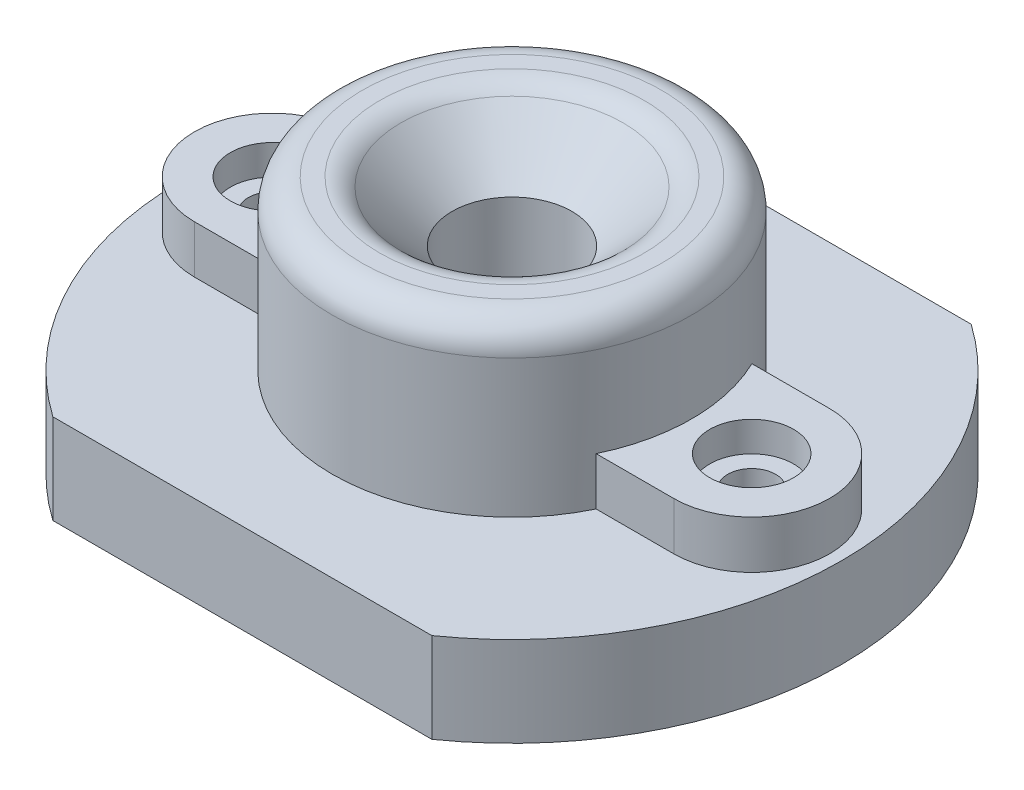
ISO-10303-21;
HEADER;
FILE_DESCRIPTION(('STEP AP214'),'2;1');
FILE_NAME('part.step','',(''),(''),'','','');
FILE_SCHEMA(('AUTOMOTIVE_DESIGN { 1 0 10303 214 1 1 1 1 }'));
ENDSEC;
DATA;
#1=APPLICATION_CONTEXT('core data for automotive mechanical design processes');
#2=APPLICATION_PROTOCOL_DEFINITION('international standard','automotive_design',2000,#1);
#3=PRODUCT_CONTEXT('',#1,'mechanical');
#4=PRODUCT('Part','Part','',(#3));
#5=PRODUCT_RELATED_PRODUCT_CATEGORY('part','',(#4));
#6=PRODUCT_DEFINITION_FORMATION('','',#4);
#7=PRODUCT_DEFINITION_CONTEXT('part definition',#1,'design');
#8=PRODUCT_DEFINITION('design','',#6,#7);
#9=PRODUCT_DEFINITION_SHAPE('','',#8);
#10=(LENGTH_UNIT() NAMED_UNIT(*) SI_UNIT(.MILLI.,.METRE.));
#11=(NAMED_UNIT(*) PLANE_ANGLE_UNIT() SI_UNIT($,.RADIAN.));
#12=(NAMED_UNIT(*) SI_UNIT($,.STERADIAN.) SOLID_ANGLE_UNIT());
#13=UNCERTAINTY_MEASURE_WITH_UNIT(LENGTH_MEASURE(1.E-05),#10,'distance_accuracy_value','');
#14=(GEOMETRIC_REPRESENTATION_CONTEXT(3) GLOBAL_UNCERTAINTY_ASSIGNED_CONTEXT((#13)) GLOBAL_UNIT_ASSIGNED_CONTEXT((#10,
#11,#12)) REPRESENTATION_CONTEXT('',''));
#15=CARTESIAN_POINT('',(0.,0.,0.));
#16=DIRECTION('',(0.,0.,1.));
#17=DIRECTION('',(1.,0.,0.));
#18=AXIS2_PLACEMENT_3D('',#15,#16,#17);
#19=CARTESIAN_POINT('',(0.,15.,0.));
#20=DIRECTION('',(0.,1.,0.));
#21=DIRECTION('',(0.,0.,1.));
#22=AXIS2_PLACEMENT_3D('',#19,#20,#21);
#23=PLANE('',#22);
#24=DIRECTION('',(1.,0.,0.));
#25=VECTOR('',#24,1.);
#26=CARTESIAN_POINT('',(0.,15.,-13.));
#27=LINE('',#26,#25);
#28=CARTESIAN_POINT('',(-40.,15.,-13.));
#29=VERTEX_POINT('',#28);
#30=CARTESIAN_POINT('',(-27.0370116691915,15.,-13.));
#31=VERTEX_POINT('',#30);
#32=EDGE_CURVE('E139',#29,#31,#27,.T.);
#33=ORIENTED_EDGE('',*,*,#32,.T.);
#34=CARTESIAN_POINT('',(0.,15.,0.));
#35=DIRECTION('',(0.,1.,0.));
#36=DIRECTION('',(0.,0.,1.));
#37=AXIS2_PLACEMENT_3D('',#34,#35,#36);
#38=CIRCLE('',#37,30.);
#39=CARTESIAN_POINT('',(27.0370116691915,15.,-13.));
#40=VERTEX_POINT('',#39);
#41=EDGE_CURVE('E240',#40,#31,#38,.T.);
#42=ORIENTED_EDGE('',*,*,#41,.F.);
#43=DIRECTION('',(-1.,0.,0.));
#44=VECTOR('',#43,1.);
#45=CARTESIAN_POINT('',(0.,15.,-13.));
#46=LINE('',#45,#44);
#47=CARTESIAN_POINT('',(40.,15.,-13.));
#48=VERTEX_POINT('',#47);
#49=EDGE_CURVE('E188',#48,#40,#46,.T.);
#50=ORIENTED_EDGE('',*,*,#49,.F.);
#51=CARTESIAN_POINT('',(40.,15.,0.));
#52=DIRECTION('',(0.,1.,0.));
#53=DIRECTION('',(0.,0.,1.));
#54=AXIS2_PLACEMENT_3D('',#51,#52,#53);
#55=CIRCLE('',#54,13.);
#56=CARTESIAN_POINT('',(40.,15.,13.));
#57=VERTEX_POINT('',#56);
#58=EDGE_CURVE('E186',#48,#57,#55,.F.);
#59=ORIENTED_EDGE('',*,*,#58,.T.);
#60=DIRECTION('',(-1.,0.,0.));
#61=VECTOR('',#60,1.);
#62=CARTESIAN_POINT('',(0.,15.,13.));
#63=LINE('',#62,#61);
#64=CARTESIAN_POINT('',(27.0370116691915,15.,13.));
#65=VERTEX_POINT('',#64);
#66=EDGE_CURVE('E176',#57,#65,#63,.T.);
#67=ORIENTED_EDGE('',*,*,#66,.T.);
#68=CARTESIAN_POINT('',(-27.0370116691915,15.,13.));
#69=VERTEX_POINT('',#68);
#70=EDGE_CURVE('E237',#69,#65,#38,.T.);
#71=ORIENTED_EDGE('',*,*,#70,.F.);
#72=DIRECTION('',(1.,0.,0.));
#73=VECTOR('',#72,1.);
#74=CARTESIAN_POINT('',(0.,15.,13.));
#75=LINE('',#74,#73);
#76=CARTESIAN_POINT('',(-40.,15.,13.));
#77=VERTEX_POINT('',#76);
#78=EDGE_CURVE('E65',#77,#69,#75,.T.);
#79=ORIENTED_EDGE('',*,*,#78,.F.);
#80=CARTESIAN_POINT('',(-40.,15.,0.));
#81=DIRECTION('',(0.,1.,0.));
#82=DIRECTION('',(0.,0.,1.));
#83=AXIS2_PLACEMENT_3D('',#80,#81,#82);
#84=CIRCLE('',#83,13.);
#85=EDGE_CURVE('E60',#29,#77,#84,.T.);
#86=ORIENTED_EDGE('',*,*,#85,.F.);
#87=EDGE_LOOP('',(#33,#42,#50,#59,#67,#71,#79,#86));
#88=FACE_BOUND('',#87,.T.);
#89=CARTESIAN_POINT('',(0.,15.,0.));
#90=DIRECTION('',(0.,1.,0.));
#91=DIRECTION('',(0.,0.,1.));
#92=AXIS2_PLACEMENT_3D('',#89,#90,#91);
#93=CIRCLE('',#92,55.);
#94=CARTESIAN_POINT('',(31.6227766016838,15.,45.));
#95=VERTEX_POINT('',#94);
#96=CARTESIAN_POINT('',(31.6227766016838,15.,-45.));
#97=VERTEX_POINT('',#96);
#98=EDGE_CURVE('E208',#95,#97,#93,.T.);
#99=ORIENTED_EDGE('',*,*,#98,.T.);
#100=DIRECTION('',(-1.,0.,0.));
#101=VECTOR('',#100,1.);
#102=CARTESIAN_POINT('',(-31.6227766016838,15.,-45.));
#103=LINE('',#102,#101);
#104=CARTESIAN_POINT('',(-31.6227766016838,15.,-45.));
#105=VERTEX_POINT('',#104);
#106=EDGE_CURVE('E211',#97,#105,#103,.T.);
#107=ORIENTED_EDGE('',*,*,#106,.T.);
#108=CARTESIAN_POINT('',(0.,15.,0.));
#109=DIRECTION('',(0.,1.,0.));
#110=DIRECTION('',(0.,0.,1.));
#111=AXIS2_PLACEMENT_3D('',#108,#109,#110);
#112=CIRCLE('',#111,55.);
#113=CARTESIAN_POINT('',(-31.6227766016838,15.,45.));
#114=VERTEX_POINT('',#113);
#115=EDGE_CURVE('E214',#105,#114,#112,.T.);
#116=ORIENTED_EDGE('',*,*,#115,.T.);
#117=DIRECTION('',(1.,0.,0.));
#118=VECTOR('',#117,1.);
#119=CARTESIAN_POINT('',(-31.6227766016838,15.,45.));
#120=LINE('',#119,#118);
#121=EDGE_CURVE('E216',#114,#95,#120,.T.);
#122=ORIENTED_EDGE('',*,*,#121,.T.);
#123=EDGE_LOOP('',(#99,#107,#116,#122));
#124=FACE_BOUND('',#123,.T.);
#125=ADVANCED_FACE('F43',(#88,#124),#23,.T.);
#126=CARTESIAN_POINT('',(0.,0.,0.));
#127=DIRECTION('',(0.,-1.,0.));
#128=DIRECTION('',(0.,0.,-1.));
#129=AXIS2_PLACEMENT_3D('',#126,#127,#128);
#130=CYLINDRICAL_SURFACE('',#129,30.);
#131=DIRECTION('',(0.,-1.,0.));
#132=VECTOR('',#131,1.);
#133=CARTESIAN_POINT('',(-27.0370116691915,23.,-13.));
#134=LINE('',#133,#132);
#135=CARTESIAN_POINT('',(-27.0370116691915,23.,-13.));
#136=VERTEX_POINT('',#135);
#137=EDGE_CURVE('E164',#136,#31,#134,.T.);
#138=ORIENTED_EDGE('',*,*,#137,.F.);
#139=CARTESIAN_POINT('',(0.,23.,0.));
#140=DIRECTION('',(0.,1.,0.));
#141=DIRECTION('',(0.,0.,1.));
#142=AXIS2_PLACEMENT_3D('',#139,#140,#141);
#143=CIRCLE('',#142,30.);
#144=CARTESIAN_POINT('',(-27.0370116691915,23.,13.));
#145=VERTEX_POINT('',#144);
#146=EDGE_CURVE('E155',#145,#136,#143,.F.);
#147=ORIENTED_EDGE('',*,*,#146,.F.);
#148=DIRECTION('',(0.,-1.,0.));
#149=VECTOR('',#148,1.);
#150=CARTESIAN_POINT('',(-27.0370116691915,23.,13.));
#151=LINE('',#150,#149);
#152=EDGE_CURVE('E169',#145,#69,#151,.T.);
#153=ORIENTED_EDGE('',*,*,#152,.T.);
#154=ORIENTED_EDGE('',*,*,#70,.T.);
#155=DIRECTION('',(0.,-1.,0.));
#156=VECTOR('',#155,1.);
#157=CARTESIAN_POINT('',(27.0370116691915,23.,13.));
#158=LINE('',#157,#156);
#159=CARTESIAN_POINT('',(27.0370116691915,23.,13.));
#160=VERTEX_POINT('',#159);
#161=EDGE_CURVE('E195',#160,#65,#158,.T.);
#162=ORIENTED_EDGE('',*,*,#161,.F.);
#163=CARTESIAN_POINT('',(0.,23.,0.));
#164=DIRECTION('',(0.,1.,0.));
#165=DIRECTION('',(0.,0.,1.));
#166=AXIS2_PLACEMENT_3D('',#163,#164,#165);
#167=CIRCLE('',#166,30.);
#168=CARTESIAN_POINT('',(27.0370116691915,23.,-13.));
#169=VERTEX_POINT('',#168);
#170=EDGE_CURVE('E179',#169,#160,#167,.F.);
#171=ORIENTED_EDGE('',*,*,#170,.F.);
#172=DIRECTION('',(0.,-1.,0.));
#173=VECTOR('',#172,1.);
#174=CARTESIAN_POINT('',(27.0370116691915,23.,-13.));
#175=LINE('',#174,#173);
#176=EDGE_CURVE('E198',#169,#40,#175,.T.);
#177=ORIENTED_EDGE('',*,*,#176,.T.);
#178=ORIENTED_EDGE('',*,*,#41,.T.);
#179=EDGE_LOOP('',(#138,#147,#153,#154,#162,#171,#177,#178));
#180=FACE_BOUND('',#179,.T.);
#181=CARTESIAN_POINT('',(0.,38.,0.));
#182=DIRECTION('',(0.,1.,0.));
#183=DIRECTION('',(0.,0.,1.));
#184=AXIS2_PLACEMENT_3D('',#181,#182,#183);
#185=CIRCLE('',#184,30.);
#186=CARTESIAN_POINT('',(0.,38.,30.));
#187=VERTEX_POINT('',#186);
#188=EDGE_CURVE('E241',#187,#187,#185,.F.);
#189=ORIENTED_EDGE('',*,*,#188,.T.);
#190=EDGE_LOOP('',(#189));
#191=FACE_BOUND('',#190,.T.);
#192=ADVANCED_FACE('F293',(#180,#191),#130,.T.);
#193=CARTESIAN_POINT('',(0.,15.,0.));
#194=DIRECTION('',(0.,-1.,0.));
#195=DIRECTION('',(0.,0.,-1.));
#196=AXIS2_PLACEMENT_3D('',#193,#194,#195);
#197=CYLINDRICAL_SURFACE('',#196,55.);
#198=CARTESIAN_POINT('',(0.,0.,0.));
#199=DIRECTION('',(0.,1.,0.));
#200=DIRECTION('',(0.,0.,1.));
#201=AXIS2_PLACEMENT_3D('',#198,#199,#200);
#202=CIRCLE('',#201,55.);
#203=CARTESIAN_POINT('',(31.6227766016838,0.,45.));
#204=VERTEX_POINT('',#203);
#205=CARTESIAN_POINT('',(31.6227766016838,0.,-45.));
#206=VERTEX_POINT('',#205);
#207=EDGE_CURVE('E207',#204,#206,#202,.T.);
#208=ORIENTED_EDGE('',*,*,#207,.T.);
#209=DIRECTION('',(0.,-1.,0.));
#210=VECTOR('',#209,1.);
#211=CARTESIAN_POINT('',(31.6227766016838,15.,-45.));
#212=LINE('',#211,#210);
#213=EDGE_CURVE('E234',#97,#206,#212,.T.);
#214=ORIENTED_EDGE('',*,*,#213,.F.);
#215=ORIENTED_EDGE('',*,*,#98,.F.);
#216=DIRECTION('',(0.,-1.,0.));
#217=VECTOR('',#216,1.);
#218=CARTESIAN_POINT('',(31.6227766016838,15.,45.));
#219=LINE('',#218,#217);
#220=EDGE_CURVE('E218',#95,#204,#219,.T.);
#221=ORIENTED_EDGE('',*,*,#220,.T.);
#222=EDGE_LOOP('',(#208,#214,#215,#221));
#223=FACE_BOUND('',#222,.T.);
#224=ADVANCED_FACE('F300',(#223),#197,.T.);
#225=CARTESIAN_POINT('',(-31.6227766016838,15.,-45.));
#226=DIRECTION('',(0.,0.,1.));
#227=DIRECTION('',(1.,0.,0.));
#228=AXIS2_PLACEMENT_3D('',#225,#226,#227);
#229=PLANE('',#228);
#230=DIRECTION('',(-1.,0.,0.));
#231=VECTOR('',#230,1.);
#232=CARTESIAN_POINT('',(-31.6227766016838,0.,-45.));
#233=LINE('',#232,#231);
#234=CARTESIAN_POINT('',(-31.6227766016838,0.,-45.));
#235=VERTEX_POINT('',#234);
#236=EDGE_CURVE('E221',#206,#235,#233,.T.);
#237=ORIENTED_EDGE('',*,*,#236,.T.);
#238=DIRECTION('',(0.,-1.,0.));
#239=VECTOR('',#238,1.);
#240=CARTESIAN_POINT('',(-31.6227766016838,15.,-45.));
#241=LINE('',#240,#239);
#242=EDGE_CURVE('E231',#105,#235,#241,.T.);
#243=ORIENTED_EDGE('',*,*,#242,.F.);
#244=ORIENTED_EDGE('',*,*,#106,.F.);
#245=ORIENTED_EDGE('',*,*,#213,.T.);
#246=EDGE_LOOP('',(#237,#243,#244,#245));
#247=FACE_BOUND('',#246,.T.);
#248=ADVANCED_FACE('F523',(#247),#229,.F.);
#249=CARTESIAN_POINT('',(0.,15.,0.));
#250=DIRECTION('',(0.,-1.,0.));
#251=DIRECTION('',(0.,0.,-1.));
#252=AXIS2_PLACEMENT_3D('',#249,#250,#251);
#253=CYLINDRICAL_SURFACE('',#252,55.);
#254=CARTESIAN_POINT('',(0.,0.,0.));
#255=DIRECTION('',(0.,1.,0.));
#256=DIRECTION('',(0.,0.,1.));
#257=AXIS2_PLACEMENT_3D('',#254,#255,#256);
#258=CIRCLE('',#257,55.);
#259=CARTESIAN_POINT('',(-31.6227766016838,0.,45.));
#260=VERTEX_POINT('',#259);
#261=EDGE_CURVE('E223',#235,#260,#258,.T.);
#262=ORIENTED_EDGE('',*,*,#261,.T.);
#263=DIRECTION('',(0.,-1.,0.));
#264=VECTOR('',#263,1.);
#265=CARTESIAN_POINT('',(-31.6227766016838,15.,45.));
#266=LINE('',#265,#264);
#267=EDGE_CURVE('E228',#114,#260,#266,.T.);
#268=ORIENTED_EDGE('',*,*,#267,.F.);
#269=ORIENTED_EDGE('',*,*,#115,.F.);
#270=ORIENTED_EDGE('',*,*,#242,.T.);
#271=EDGE_LOOP('',(#262,#268,#269,#270));
#272=FACE_BOUND('',#271,.T.);
#273=ADVANCED_FACE('F518',(#272),#253,.T.);
#274=CARTESIAN_POINT('',(-31.6227766016838,15.,45.));
#275=DIRECTION('',(0.,0.,-1.));
#276=DIRECTION('',(-1.,0.,0.));
#277=AXIS2_PLACEMENT_3D('',#274,#275,#276);
#278=PLANE('',#277);
#279=DIRECTION('',(1.,0.,0.));
#280=VECTOR('',#279,1.);
#281=CARTESIAN_POINT('',(-31.6227766016838,0.,45.));
#282=LINE('',#281,#280);
#283=EDGE_CURVE('E212',#260,#204,#282,.T.);
#284=ORIENTED_EDGE('',*,*,#283,.T.);
#285=ORIENTED_EDGE('',*,*,#220,.F.);
#286=ORIENTED_EDGE('',*,*,#121,.F.);
#287=ORIENTED_EDGE('',*,*,#267,.T.);
#288=EDGE_LOOP('',(#284,#285,#286,#287));
#289=FACE_BOUND('',#288,.T.);
#290=ADVANCED_FACE('F397',(#289),#278,.F.);
#291=CARTESIAN_POINT('',(0.,0.,0.));
#292=DIRECTION('',(0.,1.,0.));
#293=DIRECTION('',(0.,0.,1.));
#294=AXIS2_PLACEMENT_3D('',#291,#292,#293);
#295=PLANE('',#294);
#296=CARTESIAN_POINT('',(-40.,0.,0.));
#297=DIRECTION('',(0.,1.,0.));
#298=DIRECTION('',(0.,0.,1.));
#299=AXIS2_PLACEMENT_3D('',#296,#297,#298);
#300=CIRCLE('',#299,4.);
#301=CARTESIAN_POINT('',(-40.,0.,4.));
#302=VERTEX_POINT('',#301);
#303=EDGE_CURVE('E250',#302,#302,#300,.T.);
#304=ORIENTED_EDGE('',*,*,#303,.T.);
#305=EDGE_LOOP('',(#304));
#306=FACE_BOUND('',#305,.T.);
#307=CARTESIAN_POINT('',(40.,0.,0.));
#308=DIRECTION('',(0.,1.,0.));
#309=DIRECTION('',(0.,0.,1.));
#310=AXIS2_PLACEMENT_3D('',#307,#308,#309);
#311=CIRCLE('',#310,4.);
#312=CARTESIAN_POINT('',(40.,0.,4.));
#313=VERTEX_POINT('',#312);
#314=EDGE_CURVE('E255',#313,#313,#311,.T.);
#315=ORIENTED_EDGE('',*,*,#314,.T.);
#316=EDGE_LOOP('',(#315));
#317=FACE_BOUND('',#316,.T.);
#318=ORIENTED_EDGE('',*,*,#207,.F.);
#319=ORIENTED_EDGE('',*,*,#283,.F.);
#320=ORIENTED_EDGE('',*,*,#261,.F.);
#321=ORIENTED_EDGE('',*,*,#236,.F.);
#322=EDGE_LOOP('',(#318,#319,#320,#321));
#323=FACE_BOUND('',#322,.T.);
#324=ADVANCED_FACE('F317',(#306,#317,#323),#295,.F.);
#325=CARTESIAN_POINT('',(20.,43.,0.));
#326=DIRECTION('',(0.,1.,0.));
#327=DIRECTION('',(0.,0.,1.));
#328=AXIS2_PLACEMENT_3D('',#325,#326,#327);
#329=PLANE('',#328);
#330=CARTESIAN_POINT('',(0.,43.,0.));
#331=DIRECTION('',(0.,1.,0.));
#332=DIRECTION('',(0.,0.,1.));
#333=AXIS2_PLACEMENT_3D('',#330,#331,#332);
#334=CIRCLE('',#333,25.);
#335=CARTESIAN_POINT('',(0.,43.,25.));
#336=VERTEX_POINT('',#335);
#337=EDGE_CURVE('E52',#336,#336,#334,.T.);
#338=ORIENTED_EDGE('',*,*,#337,.T.);
#339=EDGE_LOOP('',(#338));
#340=FACE_BOUND('',#339,.T.);
#341=CARTESIAN_POINT('',(0.,43.,0.));
#342=DIRECTION('',(0.,1.,0.));
#343=DIRECTION('',(0.,0.,1.));
#344=AXIS2_PLACEMENT_3D('',#341,#342,#343);
#345=CIRCLE('',#344,22.0710678118655);
#346=CARTESIAN_POINT('',(0.,43.,22.0710678118655));
#347=VERTEX_POINT('',#346);
#348=EDGE_CURVE('E244',#347,#347,#345,.F.);
#349=ORIENTED_EDGE('',*,*,#348,.T.);
#350=EDGE_LOOP('',(#349));
#351=FACE_BOUND('',#350,.T.);
#352=ADVANCED_FACE('F308',(#340,#351),#329,.T.);
#353=CARTESIAN_POINT('',(0.,15.,0.));
#354=DIRECTION('',(0.,1.,0.));
#355=DIRECTION('',(0.,0.,1.));
#356=AXIS2_PLACEMENT_3D('',#353,#354,#355);
#357=CIRCLE('',#356,10.);
#358=CARTESIAN_POINT('',(0.,15.,10.));
#359=VERTEX_POINT('',#358);
#360=EDGE_CURVE('E204',#359,#359,#357,.T.);
#361=ORIENTED_EDGE('',*,*,#360,.T.);
#362=EDGE_LOOP('',(#361));
#363=FACE_BOUND('',#362,.T.);
#364=ADVANCED_FACE('F295',(#363),#23,.T.);
#365=CARTESIAN_POINT('',(0.,0.,0.));
#366=DIRECTION('',(0.,-1.,0.));
#367=DIRECTION('',(0.,0.,-1.));
#368=AXIS2_PLACEMENT_3D('',#365,#366,#367);
#369=CYLINDRICAL_SURFACE('',#368,10.);
#370=ORIENTED_EDGE('',*,*,#360,.F.);
#371=EDGE_LOOP('',(#370));
#372=FACE_BOUND('',#371,.T.);
#373=CARTESIAN_POINT('',(0.,33.,0.));
#374=DIRECTION('',(0.,-1.,0.));
#375=DIRECTION('',(0.,0.,-1.));
#376=AXIS2_PLACEMENT_3D('',#373,#374,#375);
#377=CIRCLE('',#376,10.);
#378=CARTESIAN_POINT('',(0.,33.,-10.));
#379=VERTEX_POINT('',#378);
#380=EDGE_CURVE('E141',#379,#379,#377,.T.);
#381=ORIENTED_EDGE('',*,*,#380,.F.);
#382=EDGE_LOOP('',(#381));
#383=FACE_BOUND('',#382,.T.);
#384=ADVANCED_FACE('F307',(#372,#383),#369,.F.);
#385=CARTESIAN_POINT('',(0.,43.,0.));
#386=DIRECTION('',(0.,1.,0.));
#387=DIRECTION('',(0.,0.,1.));
#388=AXIS2_PLACEMENT_3D('',#385,#386,#387);
#389=CONICAL_SURFACE('',#388,20.,0.785398163397448);
#390=CARTESIAN_POINT('',(0.,41.5355339059327,0.));
#391=DIRECTION('',(0.,-1.,0.));
#392=DIRECTION('',(0.,0.,-1.));
#393=AXIS2_PLACEMENT_3D('',#390,#391,#392);
#394=CIRCLE('',#393,18.5355339059327);
#395=CARTESIAN_POINT('',(0.,41.5355339059327,-18.5355339059327));
#396=VERTEX_POINT('',#395);
#397=EDGE_CURVE('E11',#396,#396,#394,.F.);
#398=ORIENTED_EDGE('',*,*,#397,.T.);
#399=EDGE_LOOP('',(#398));
#400=FACE_BOUND('',#399,.T.);
#401=ORIENTED_EDGE('',*,*,#380,.T.);
#402=EDGE_LOOP('',(#401));
#403=FACE_BOUND('',#402,.T.);
#404=ADVANCED_FACE('F314',(#400,#403),#389,.F.);
#405=CARTESIAN_POINT('',(0.,38.,0.));
#406=DIRECTION('',(0.,1.,0.));
#407=DIRECTION('',(0.,0.,1.));
#408=AXIS2_PLACEMENT_3D('',#405,#406,#407);
#409=TOROIDAL_SURFACE('',#408,25.,5.);
#410=ORIENTED_EDGE('',*,*,#337,.F.);
#411=EDGE_LOOP('',(#410));
#412=FACE_BOUND('',#411,.T.);
#413=ORIENTED_EDGE('',*,*,#188,.F.);
#414=EDGE_LOOP('',(#413));
#415=FACE_BOUND('',#414,.T.);
#416=ADVANCED_FACE('F325',(#412,#415),#409,.T.);
#417=CARTESIAN_POINT('',(0.,38.,0.));
#418=DIRECTION('',(0.,1.,0.));
#419=DIRECTION('',(0.,0.,1.));
#420=AXIS2_PLACEMENT_3D('',#417,#418,#419);
#421=TOROIDAL_SURFACE('',#420,22.0710678118655,5.);
#422=ORIENTED_EDGE('',*,*,#397,.F.);
#423=EDGE_LOOP('',(#422));
#424=FACE_BOUND('',#423,.T.);
#425=ORIENTED_EDGE('',*,*,#348,.F.);
#426=EDGE_LOOP('',(#425));
#427=FACE_BOUND('',#426,.T.);
#428=ADVANCED_FACE('F45',(#424,#427),#421,.T.);
#429=CARTESIAN_POINT('',(40.,23.,0.));
#430=DIRECTION('',(0.,-1.,0.));
#431=DIRECTION('',(0.,0.,-1.));
#432=AXIS2_PLACEMENT_3D('',#429,#430,#431);
#433=CYLINDRICAL_SURFACE('',#432,13.);
#434=ORIENTED_EDGE('',*,*,#58,.F.);
#435=DIRECTION('',(0.,-1.,0.));
#436=VECTOR('',#435,1.);
#437=CARTESIAN_POINT('',(40.,23.,-13.));
#438=LINE('',#437,#436);
#439=CARTESIAN_POINT('',(40.,23.,-13.));
#440=VERTEX_POINT('',#439);
#441=EDGE_CURVE('E166',#440,#48,#438,.T.);
#442=ORIENTED_EDGE('',*,*,#441,.F.);
#443=CARTESIAN_POINT('',(40.,23.,0.));
#444=DIRECTION('',(0.,1.,0.));
#445=DIRECTION('',(0.,0.,1.));
#446=AXIS2_PLACEMENT_3D('',#443,#444,#445);
#447=CIRCLE('',#446,13.);
#448=CARTESIAN_POINT('',(40.,23.,13.));
#449=VERTEX_POINT('',#448);
#450=EDGE_CURVE('E172',#440,#449,#447,.F.);
#451=ORIENTED_EDGE('',*,*,#450,.T.);
#452=DIRECTION('',(0.,-1.,0.));
#453=VECTOR('',#452,1.);
#454=CARTESIAN_POINT('',(40.,23.,13.));
#455=LINE('',#454,#453);
#456=EDGE_CURVE('E185',#449,#57,#455,.T.);
#457=ORIENTED_EDGE('',*,*,#456,.T.);
#458=EDGE_LOOP('',(#434,#442,#451,#457));
#459=FACE_BOUND('',#458,.T.);
#460=ADVANCED_FACE('F332',(#459),#433,.T.);
#461=CARTESIAN_POINT('',(0.,23.,-13.));
#462=DIRECTION('',(0.,0.,1.));
#463=DIRECTION('',(1.,0.,0.));
#464=AXIS2_PLACEMENT_3D('',#461,#462,#463);
#465=PLANE('',#464);
#466=ORIENTED_EDGE('',*,*,#49,.T.);
#467=ORIENTED_EDGE('',*,*,#176,.F.);
#468=DIRECTION('',(-1.,0.,0.));
#469=VECTOR('',#468,1.);
#470=CARTESIAN_POINT('',(0.,23.,-13.));
#471=LINE('',#470,#469);
#472=EDGE_CURVE('E175',#440,#169,#471,.T.);
#473=ORIENTED_EDGE('',*,*,#472,.F.);
#474=ORIENTED_EDGE('',*,*,#441,.T.);
#475=EDGE_LOOP('',(#466,#467,#473,#474));
#476=FACE_BOUND('',#475,.T.);
#477=ADVANCED_FACE('F335',(#476),#465,.F.);
#478=CARTESIAN_POINT('',(0.,23.,13.));
#479=DIRECTION('',(0.,0.,1.));
#480=DIRECTION('',(1.,0.,0.));
#481=AXIS2_PLACEMENT_3D('',#478,#479,#480);
#482=PLANE('',#481);
#483=ORIENTED_EDGE('',*,*,#66,.F.);
#484=ORIENTED_EDGE('',*,*,#456,.F.);
#485=DIRECTION('',(-1.,0.,0.));
#486=VECTOR('',#485,1.);
#487=CARTESIAN_POINT('',(0.,23.,13.));
#488=LINE('',#487,#486);
#489=EDGE_CURVE('E182',#449,#160,#488,.T.);
#490=ORIENTED_EDGE('',*,*,#489,.T.);
#491=ORIENTED_EDGE('',*,*,#161,.T.);
#492=EDGE_LOOP('',(#483,#484,#490,#491));
#493=FACE_BOUND('',#492,.T.);
#494=ADVANCED_FACE('F339',(#493),#482,.T.);
#495=CARTESIAN_POINT('',(0.,23.,0.));
#496=DIRECTION('',(0.,1.,0.));
#497=DIRECTION('',(0.,0.,1.));
#498=AXIS2_PLACEMENT_3D('',#495,#496,#497);
#499=PLANE('',#498);
#500=CARTESIAN_POINT('',(40.,23.,0.));
#501=DIRECTION('',(0.,1.,0.));
#502=DIRECTION('',(0.,0.,1.));
#503=AXIS2_PLACEMENT_3D('',#500,#501,#502);
#504=CIRCLE('',#503,7.);
#505=CARTESIAN_POINT('',(40.,23.,7.));
#506=VERTEX_POINT('',#505);
#507=EDGE_CURVE('E266',#506,#506,#504,.T.);
#508=ORIENTED_EDGE('',*,*,#507,.F.);
#509=EDGE_LOOP('',(#508));
#510=FACE_BOUND('',#509,.T.);
#511=ORIENTED_EDGE('',*,*,#450,.F.);
#512=ORIENTED_EDGE('',*,*,#472,.T.);
#513=ORIENTED_EDGE('',*,*,#170,.T.);
#514=ORIENTED_EDGE('',*,*,#489,.F.);
#515=EDGE_LOOP('',(#511,#512,#513,#514));
#516=FACE_BOUND('',#515,.T.);
#517=ADVANCED_FACE('F343',(#510,#516),#499,.T.);
#518=CARTESIAN_POINT('',(0.,23.,-13.));
#519=DIRECTION('',(0.,0.,-1.));
#520=DIRECTION('',(-1.,0.,0.));
#521=AXIS2_PLACEMENT_3D('',#518,#519,#520);
#522=PLANE('',#521);
#523=ORIENTED_EDGE('',*,*,#32,.F.);
#524=DIRECTION('',(0.,-1.,0.));
#525=VECTOR('',#524,1.);
#526=CARTESIAN_POINT('',(-40.,23.,-13.));
#527=LINE('',#526,#525);
#528=CARTESIAN_POINT('',(-40.,23.,-13.));
#529=VERTEX_POINT('',#528);
#530=EDGE_CURVE('E133',#529,#29,#527,.T.);
#531=ORIENTED_EDGE('',*,*,#530,.F.);
#532=DIRECTION('',(1.,0.,0.));
#533=VECTOR('',#532,1.);
#534=CARTESIAN_POINT('',(0.,23.,-13.));
#535=LINE('',#534,#533);
#536=EDGE_CURVE('E138',#529,#136,#535,.T.);
#537=ORIENTED_EDGE('',*,*,#536,.T.);
#538=ORIENTED_EDGE('',*,*,#137,.T.);
#539=EDGE_LOOP('',(#523,#531,#537,#538));
#540=FACE_BOUND('',#539,.T.);
#541=ADVANCED_FACE('F135',(#540),#522,.T.);
#542=CARTESIAN_POINT('',(-40.,23.,0.));
#543=DIRECTION('',(0.,-1.,0.));
#544=DIRECTION('',(0.,0.,-1.));
#545=AXIS2_PLACEMENT_3D('',#542,#543,#544);
#546=CYLINDRICAL_SURFACE('',#545,13.);
#547=ORIENTED_EDGE('',*,*,#85,.T.);
#548=DIRECTION('',(0.,-1.,0.));
#549=VECTOR('',#548,1.);
#550=CARTESIAN_POINT('',(-40.,23.,13.));
#551=LINE('',#550,#549);
#552=CARTESIAN_POINT('',(-40.,23.,13.));
#553=VERTEX_POINT('',#552);
#554=EDGE_CURVE('E142',#553,#77,#551,.T.);
#555=ORIENTED_EDGE('',*,*,#554,.F.);
#556=CARTESIAN_POINT('',(-40.,23.,0.));
#557=DIRECTION('',(0.,1.,0.));
#558=DIRECTION('',(0.,0.,1.));
#559=AXIS2_PLACEMENT_3D('',#556,#557,#558);
#560=CIRCLE('',#559,13.);
#561=EDGE_CURVE('E145',#529,#553,#560,.T.);
#562=ORIENTED_EDGE('',*,*,#561,.F.);
#563=ORIENTED_EDGE('',*,*,#530,.T.);
#564=EDGE_LOOP('',(#547,#555,#562,#563));
#565=FACE_BOUND('',#564,.T.);
#566=ADVANCED_FACE('F146',(#565),#546,.T.);
#567=CARTESIAN_POINT('',(0.,23.,13.));
#568=DIRECTION('',(0.,0.,-1.));
#569=DIRECTION('',(-1.,0.,0.));
#570=AXIS2_PLACEMENT_3D('',#567,#568,#569);
#571=PLANE('',#570);
#572=ORIENTED_EDGE('',*,*,#78,.T.);
#573=ORIENTED_EDGE('',*,*,#152,.F.);
#574=DIRECTION('',(1.,0.,0.));
#575=VECTOR('',#574,1.);
#576=CARTESIAN_POINT('',(0.,23.,13.));
#577=LINE('',#576,#575);
#578=EDGE_CURVE('E151',#553,#145,#577,.T.);
#579=ORIENTED_EDGE('',*,*,#578,.F.);
#580=ORIENTED_EDGE('',*,*,#554,.T.);
#581=EDGE_LOOP('',(#572,#573,#579,#580));
#582=FACE_BOUND('',#581,.T.);
#583=ADVANCED_FACE('F352',(#582),#571,.F.);
#584=CARTESIAN_POINT('',(0.,23.,0.));
#585=DIRECTION('',(0.,1.,0.));
#586=DIRECTION('',(0.,0.,1.));
#587=AXIS2_PLACEMENT_3D('',#584,#585,#586);
#588=PLANE('',#587);
#589=CARTESIAN_POINT('',(-40.,23.,0.));
#590=DIRECTION('',(0.,1.,0.));
#591=DIRECTION('',(0.,0.,1.));
#592=AXIS2_PLACEMENT_3D('',#589,#590,#591);
#593=CIRCLE('',#592,7.);
#594=CARTESIAN_POINT('',(-40.,23.,7.));
#595=VERTEX_POINT('',#594);
#596=EDGE_CURVE('E264',#595,#595,#593,.T.);
#597=ORIENTED_EDGE('',*,*,#596,.F.);
#598=EDGE_LOOP('',(#597));
#599=FACE_BOUND('',#598,.T.);
#600=ORIENTED_EDGE('',*,*,#536,.F.);
#601=ORIENTED_EDGE('',*,*,#561,.T.);
#602=ORIENTED_EDGE('',*,*,#578,.T.);
#603=ORIENTED_EDGE('',*,*,#146,.T.);
#604=EDGE_LOOP('',(#600,#601,#602,#603));
#605=FACE_BOUND('',#604,.T.);
#606=ADVANCED_FACE('F154',(#599,#605),#588,.T.);
#607=CARTESIAN_POINT('',(-40.,18.,0.));
#608=DIRECTION('',(0.,1.,0.));
#609=DIRECTION('',(0.,0.,1.));
#610=AXIS2_PLACEMENT_3D('',#607,#608,#609);
#611=CYLINDRICAL_SURFACE('',#610,7.);
#612=CARTESIAN_POINT('',(-40.,18.,0.));
#613=DIRECTION('',(0.,1.,0.));
#614=DIRECTION('',(0.,0.,1.));
#615=AXIS2_PLACEMENT_3D('',#612,#613,#614);
#616=CIRCLE('',#615,7.);
#617=CARTESIAN_POINT('',(-40.,18.,7.));
#618=VERTEX_POINT('',#617);
#619=EDGE_CURVE('E189',#618,#618,#616,.T.);
#620=ORIENTED_EDGE('',*,*,#619,.F.);
#621=EDGE_LOOP('',(#620));
#622=FACE_BOUND('',#621,.T.);
#623=ORIENTED_EDGE('',*,*,#596,.T.);
#624=EDGE_LOOP('',(#623));
#625=FACE_BOUND('',#624,.T.);
#626=ADVANCED_FACE('F288',(#622,#625),#611,.F.);
#627=CARTESIAN_POINT('',(-40.,18.,0.));
#628=DIRECTION('',(0.,1.,0.));
#629=DIRECTION('',(0.,0.,1.));
#630=AXIS2_PLACEMENT_3D('',#627,#628,#629);
#631=PLANE('',#630);
#632=CARTESIAN_POINT('',(-40.,18.,0.));
#633=DIRECTION('',(0.,1.,0.));
#634=DIRECTION('',(0.,0.,1.));
#635=AXIS2_PLACEMENT_3D('',#632,#633,#634);
#636=CIRCLE('',#635,4.);
#637=CARTESIAN_POINT('',(-40.,18.,4.));
#638=VERTEX_POINT('',#637);
#639=EDGE_CURVE('E47',#638,#638,#636,.T.);
#640=ORIENTED_EDGE('',*,*,#639,.F.);
#641=EDGE_LOOP('',(#640));
#642=FACE_BOUND('',#641,.T.);
#643=ORIENTED_EDGE('',*,*,#619,.T.);
#644=EDGE_LOOP('',(#643));
#645=FACE_BOUND('',#644,.T.);
#646=ADVANCED_FACE('F277',(#642,#645),#631,.T.);
#647=CARTESIAN_POINT('',(40.,18.,0.));
#648=DIRECTION('',(0.,1.,0.));
#649=DIRECTION('',(0.,0.,1.));
#650=AXIS2_PLACEMENT_3D('',#647,#648,#649);
#651=CYLINDRICAL_SURFACE('',#650,7.);
#652=CARTESIAN_POINT('',(40.,18.,0.));
#653=DIRECTION('',(0.,1.,0.));
#654=DIRECTION('',(0.,0.,1.));
#655=AXIS2_PLACEMENT_3D('',#652,#653,#654);
#656=CIRCLE('',#655,7.);
#657=CARTESIAN_POINT('',(40.,18.,7.));
#658=VERTEX_POINT('',#657);
#659=EDGE_CURVE('E159',#658,#658,#656,.T.);
#660=ORIENTED_EDGE('',*,*,#659,.F.);
#661=EDGE_LOOP('',(#660));
#662=FACE_BOUND('',#661,.T.);
#663=ORIENTED_EDGE('',*,*,#507,.T.);
#664=EDGE_LOOP('',(#663));
#665=FACE_BOUND('',#664,.T.);
#666=ADVANCED_FACE('F275',(#662,#665),#651,.F.);
#667=CARTESIAN_POINT('',(40.,18.,0.));
#668=DIRECTION('',(0.,1.,0.));
#669=DIRECTION('',(0.,0.,1.));
#670=AXIS2_PLACEMENT_3D('',#667,#668,#669);
#671=PLANE('',#670);
#672=CARTESIAN_POINT('',(40.,18.,0.));
#673=DIRECTION('',(0.,1.,0.));
#674=DIRECTION('',(0.,0.,1.));
#675=AXIS2_PLACEMENT_3D('',#672,#673,#674);
#676=CIRCLE('',#675,4.);
#677=CARTESIAN_POINT('',(40.,18.,4.));
#678=VERTEX_POINT('',#677);
#679=EDGE_CURVE('E248',#678,#678,#676,.T.);
#680=ORIENTED_EDGE('',*,*,#679,.F.);
#681=EDGE_LOOP('',(#680));
#682=FACE_BOUND('',#681,.T.);
#683=ORIENTED_EDGE('',*,*,#659,.T.);
#684=EDGE_LOOP('',(#683));
#685=FACE_BOUND('',#684,.T.);
#686=ADVANCED_FACE('F273',(#682,#685),#671,.T.);
#687=CARTESIAN_POINT('',(40.,0.,0.));
#688=DIRECTION('',(0.,1.,0.));
#689=DIRECTION('',(0.,0.,1.));
#690=AXIS2_PLACEMENT_3D('',#687,#688,#689);
#691=CYLINDRICAL_SURFACE('',#690,4.);
#692=ORIENTED_EDGE('',*,*,#679,.T.);
#693=EDGE_LOOP('',(#692));
#694=FACE_BOUND('',#693,.T.);
#695=ORIENTED_EDGE('',*,*,#314,.F.);
#696=EDGE_LOOP('',(#695));
#697=FACE_BOUND('',#696,.T.);
#698=ADVANCED_FACE('F284',(#694,#697),#691,.F.);
#699=CARTESIAN_POINT('',(-40.,0.,0.));
#700=DIRECTION('',(0.,1.,0.));
#701=DIRECTION('',(0.,0.,1.));
#702=AXIS2_PLACEMENT_3D('',#699,#700,#701);
#703=CYLINDRICAL_SURFACE('',#702,4.);
#704=ORIENTED_EDGE('',*,*,#639,.T.);
#705=EDGE_LOOP('',(#704));
#706=FACE_BOUND('',#705,.T.);
#707=ORIENTED_EDGE('',*,*,#303,.F.);
#708=EDGE_LOOP('',(#707));
#709=FACE_BOUND('',#708,.T.);
#710=ADVANCED_FACE('F369',(#706,#709),#703,.F.);
#711=CLOSED_SHELL('',(#125,#192,#224,#248,#273,#290,#324,#352,#364,#384,#404,#416,#428,#460,
#477,#494,#517,#541,#566,#583,#606,#626,#646,#666,#686,#698,#710));
#712=MANIFOLD_SOLID_BREP('B2',#711);
#713=ADVANCED_BREP_SHAPE_REPRESENTATION('',(#18,#712),#14);
#714=SHAPE_DEFINITION_REPRESENTATION(#9,#713);
ENDSEC;
END-ISO-10303-21;
